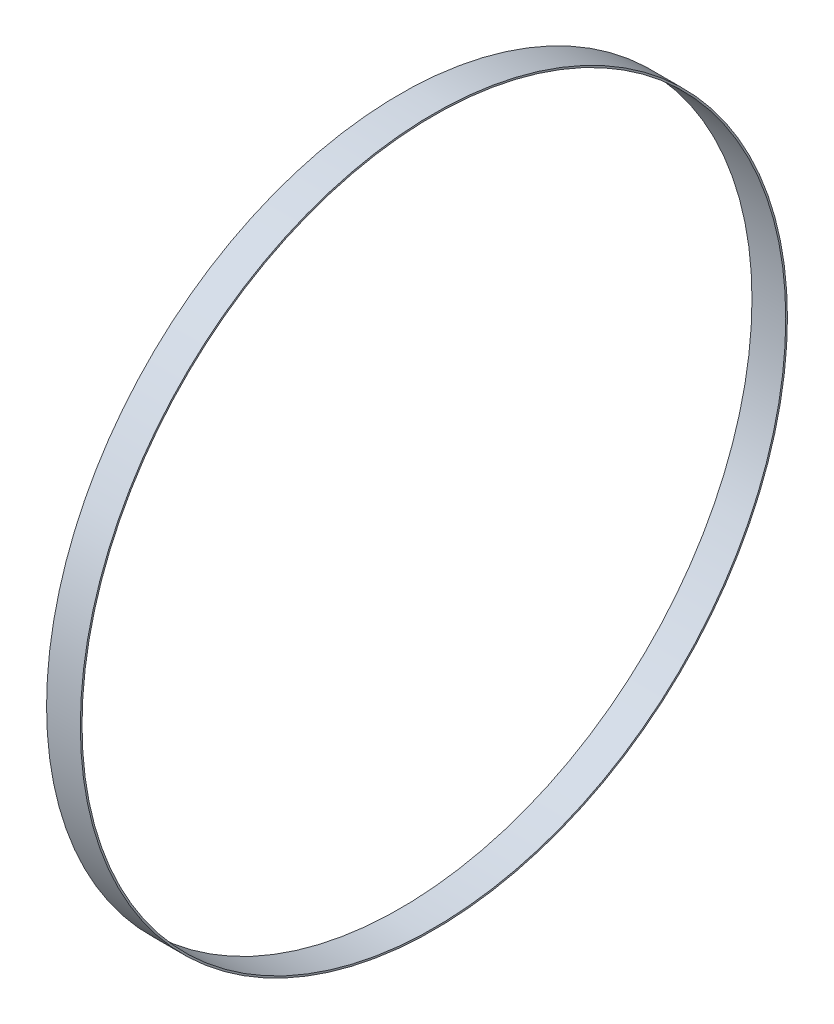
ISO-10303-21;
HEADER;
FILE_DESCRIPTION(('STEP AP214'),'2;1');
FILE_NAME('part.step','',(''),(''),'','','');
FILE_SCHEMA(('AUTOMOTIVE_DESIGN { 1 0 10303 214 1 1 1 1 }'));
ENDSEC;
DATA;
#1=APPLICATION_CONTEXT('core data for automotive mechanical design processes');
#2=APPLICATION_PROTOCOL_DEFINITION('international standard','automotive_design',2000,#1);
#3=PRODUCT_CONTEXT('',#1,'mechanical');
#4=PRODUCT('Part','Part','',(#3));
#5=PRODUCT_RELATED_PRODUCT_CATEGORY('part','',(#4));
#6=PRODUCT_DEFINITION_FORMATION('','',#4);
#7=PRODUCT_DEFINITION_CONTEXT('part definition',#1,'design');
#8=PRODUCT_DEFINITION('design','',#6,#7);
#9=PRODUCT_DEFINITION_SHAPE('','',#8);
#10=(LENGTH_UNIT() NAMED_UNIT(*) SI_UNIT(.MILLI.,.METRE.));
#11=(NAMED_UNIT(*) PLANE_ANGLE_UNIT() SI_UNIT($,.RADIAN.));
#12=(NAMED_UNIT(*) SI_UNIT($,.STERADIAN.) SOLID_ANGLE_UNIT());
#13=UNCERTAINTY_MEASURE_WITH_UNIT(LENGTH_MEASURE(1.E-05),#10,'distance_accuracy_value','');
#14=(GEOMETRIC_REPRESENTATION_CONTEXT(3) GLOBAL_UNCERTAINTY_ASSIGNED_CONTEXT((#13)) GLOBAL_UNIT_ASSIGNED_CONTEXT((#10,
#11,#12)) REPRESENTATION_CONTEXT('',''));
#15=CARTESIAN_POINT('',(0.,0.,0.));
#16=DIRECTION('',(0.,0.,1.));
#17=DIRECTION('',(1.,0.,0.));
#18=AXIS2_PLACEMENT_3D('',#15,#16,#17);
#19=CARTESIAN_POINT('',(100.,0.,0.));
#20=DIRECTION('',(1.,0.,0.));
#21=DIRECTION('',(0.,0.,-1.00000000000001));
#22=AXIS2_PLACEMENT_3D('',#19,#20,#21);
#23=PLANE('',#22);
#24=CARTESIAN_POINT('',(100.,0.,0.));
#25=DIRECTION('',(1.,0.,0.));
#26=DIRECTION('',(0.,0.,-1.00000000000001));
#27=AXIS2_PLACEMENT_3D('',#24,#25,#26);
#28=CIRCLE('',#27,1047.);
#29=CARTESIAN_POINT('',(100.,-1.16240350678254E-13,-1047.00000000001));
#30=VERTEX_POINT('',#29);
#31=EDGE_CURVE('E12',#30,#30,#28,.T.);
#32=ORIENTED_EDGE('',*,*,#31,.T.);
#33=EDGE_LOOP('',(#32));
#34=FACE_BOUND('',#33,.T.);
#35=CARTESIAN_POINT('',(100.,0.,0.));
#36=DIRECTION('',(1.,0.,0.));
#37=DIRECTION('',(0.,0.,-1.00000000000001));
#38=AXIS2_PLACEMENT_3D('',#35,#36,#37);
#39=CIRCLE('',#38,1042.);
#40=CARTESIAN_POINT('',(100.,-1.15685239165941E-13,-1042.00000000001));
#41=VERTEX_POINT('',#40);
#42=EDGE_CURVE('E51',#41,#41,#39,.T.);
#43=ORIENTED_EDGE('',*,*,#42,.F.);
#44=EDGE_LOOP('',(#43));
#45=FACE_BOUND('',#44,.T.);
#46=ADVANCED_FACE('F40',(#34,#45),#23,.T.);
#47=CARTESIAN_POINT('',(0.,0.,0.));
#48=DIRECTION('',(1.,0.,0.));
#49=DIRECTION('',(0.,0.,-1.00000000000001));
#50=AXIS2_PLACEMENT_3D('',#47,#48,#49);
#51=PLANE('',#50);
#52=CARTESIAN_POINT('',(0.,0.,0.));
#53=DIRECTION('',(1.,0.,0.));
#54=DIRECTION('',(0.,0.,-1.00000000000001));
#55=AXIS2_PLACEMENT_3D('',#52,#53,#54);
#56=CIRCLE('',#55,1047.);
#57=CARTESIAN_POINT('',(0.,-1.16240350678254E-13,-1047.00000000001));
#58=VERTEX_POINT('',#57);
#59=EDGE_CURVE('E44',#58,#58,#56,.T.);
#60=ORIENTED_EDGE('',*,*,#59,.F.);
#61=EDGE_LOOP('',(#60));
#62=FACE_BOUND('',#61,.T.);
#63=CARTESIAN_POINT('',(0.,0.,0.));
#64=DIRECTION('',(1.,0.,0.));
#65=DIRECTION('',(0.,0.,-1.00000000000001));
#66=AXIS2_PLACEMENT_3D('',#63,#64,#65);
#67=CIRCLE('',#66,1042.);
#68=CARTESIAN_POINT('',(0.,-1.15685239165941E-13,-1042.00000000001));
#69=VERTEX_POINT('',#68);
#70=EDGE_CURVE('E53',#69,#69,#67,.T.);
#71=ORIENTED_EDGE('',*,*,#70,.T.);
#72=EDGE_LOOP('',(#71));
#73=FACE_BOUND('',#72,.T.);
#74=ADVANCED_FACE('F63',(#62,#73),#51,.F.);
#75=CARTESIAN_POINT('',(100.,0.,0.));
#76=DIRECTION('',(-1.,0.,0.));
#77=DIRECTION('',(0.,0.,1.00000000000001));
#78=AXIS2_PLACEMENT_3D('',#75,#76,#77);
#79=CYLINDRICAL_SURFACE('',#78,1047.);
#80=ORIENTED_EDGE('',*,*,#31,.F.);
#81=EDGE_LOOP('',(#80));
#82=FACE_BOUND('',#81,.T.);
#83=ORIENTED_EDGE('',*,*,#59,.T.);
#84=EDGE_LOOP('',(#83));
#85=FACE_BOUND('',#84,.T.);
#86=ADVANCED_FACE('F42',(#82,#85),#79,.T.);
#87=CARTESIAN_POINT('',(100.,0.,0.));
#88=DIRECTION('',(-1.,0.,0.));
#89=DIRECTION('',(0.,0.,1.00000000000001));
#90=AXIS2_PLACEMENT_3D('',#87,#88,#89);
#91=CYLINDRICAL_SURFACE('',#90,1042.);
#92=ORIENTED_EDGE('',*,*,#42,.T.);
#93=EDGE_LOOP('',(#92));
#94=FACE_BOUND('',#93,.T.);
#95=ORIENTED_EDGE('',*,*,#70,.F.);
#96=EDGE_LOOP('',(#95));
#97=FACE_BOUND('',#96,.T.);
#98=ADVANCED_FACE('F59',(#94,#97),#91,.F.);
#99=CLOSED_SHELL('',(#46,#74,#86,#98));
#100=MANIFOLD_SOLID_BREP('B2',#99);
#101=ADVANCED_BREP_SHAPE_REPRESENTATION('',(#18,#100),#14);
#102=SHAPE_DEFINITION_REPRESENTATION(#9,#101);
ENDSEC;
END-ISO-10303-21;
